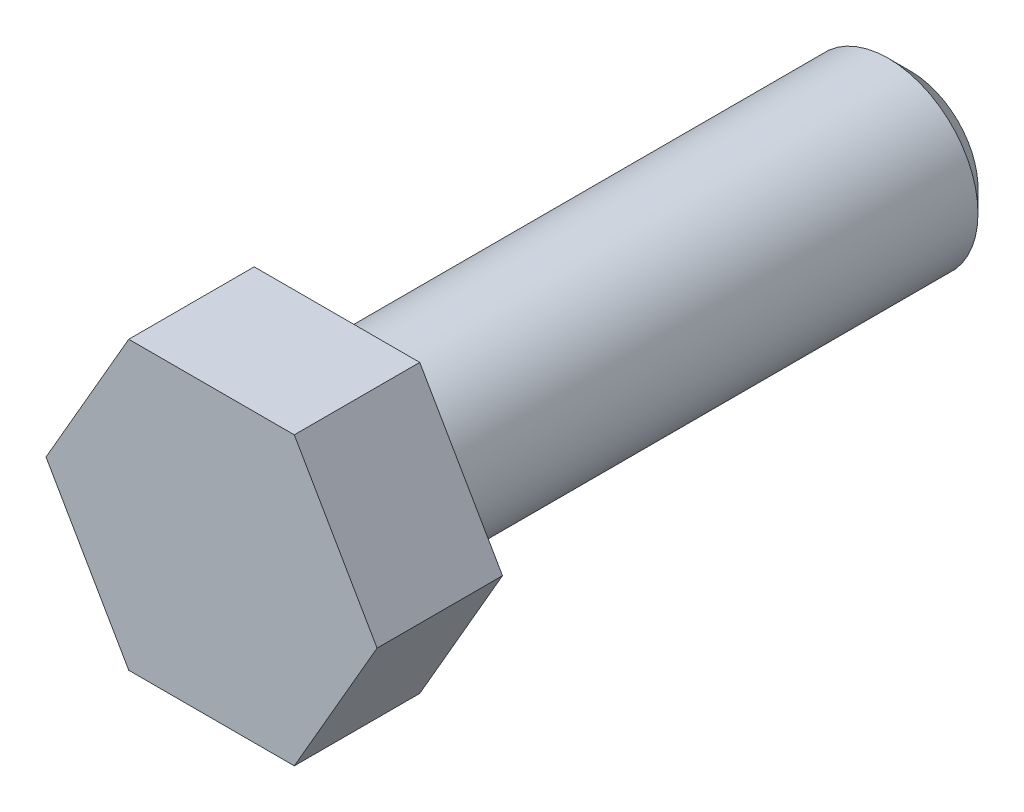
ISO-10303-21;
HEADER;
FILE_DESCRIPTION(('STEP AP214'),'2;1');
FILE_NAME('part.step','',(''),(''),'','','');
FILE_SCHEMA(('AUTOMOTIVE_DESIGN { 1 0 10303 214 1 1 1 1 }'));
ENDSEC;
DATA;
#1=APPLICATION_CONTEXT('core data for automotive mechanical design processes');
#2=APPLICATION_PROTOCOL_DEFINITION('international standard','automotive_design',2000,#1);
#3=PRODUCT_CONTEXT('',#1,'mechanical');
#4=PRODUCT('Part','Part','',(#3));
#5=PRODUCT_RELATED_PRODUCT_CATEGORY('part','',(#4));
#6=PRODUCT_DEFINITION_FORMATION('','',#4);
#7=PRODUCT_DEFINITION_CONTEXT('part definition',#1,'design');
#8=PRODUCT_DEFINITION('design','',#6,#7);
#9=PRODUCT_DEFINITION_SHAPE('','',#8);
#10=(LENGTH_UNIT() NAMED_UNIT(*) SI_UNIT(.MILLI.,.METRE.));
#11=(NAMED_UNIT(*) PLANE_ANGLE_UNIT() SI_UNIT($,.RADIAN.));
#12=(NAMED_UNIT(*) SI_UNIT($,.STERADIAN.) SOLID_ANGLE_UNIT());
#13=UNCERTAINTY_MEASURE_WITH_UNIT(LENGTH_MEASURE(1.E-05),#10,'distance_accuracy_value','');
#14=(GEOMETRIC_REPRESENTATION_CONTEXT(3) GLOBAL_UNCERTAINTY_ASSIGNED_CONTEXT((#13)) GLOBAL_UNIT_ASSIGNED_CONTEXT((#10,
#11,#12)) REPRESENTATION_CONTEXT('',''));
#15=CARTESIAN_POINT('',(0.,0.,0.));
#16=DIRECTION('',(0.,0.,1.));
#17=DIRECTION('',(1.,0.,0.));
#18=AXIS2_PLACEMENT_3D('',#15,#16,#17);
#19=CARTESIAN_POINT('',(-6.9282032302755,-4.,0.));
#20=DIRECTION('',(0.,0.,1.));
#21=DIRECTION('',(1.,0.,0.));
#22=AXIS2_PLACEMENT_3D('',#19,#20,#21);
#23=PLANE('',#22);
#24=CARTESIAN_POINT('',(0.,0.,0.));
#25=DIRECTION('',(0.,0.,1.));
#26=DIRECTION('',(1.,0.,0.));
#27=AXIS2_PLACEMENT_3D('',#24,#25,#26);
#28=CIRCLE('',#27,2.75);
#29=CARTESIAN_POINT('',(2.75,0.,0.));
#30=VERTEX_POINT('',#29);
#31=EDGE_CURVE('E11',#30,#30,#28,.T.);
#32=ORIENTED_EDGE('',*,*,#31,.T.);
#33=EDGE_LOOP('',(#32));
#34=FACE_BOUND('',#33,.T.);
#35=DIRECTION('',(-0.499999999999999,-0.866025403784439,0.));
#36=VECTOR('',#35,1.);
#37=CARTESIAN_POINT('',(-2.30940107675851,4.,0.));
#38=LINE('',#37,#36);
#39=CARTESIAN_POINT('',(-2.30940107675851,4.,0.));
#40=VERTEX_POINT('',#39);
#41=CARTESIAN_POINT('',(-4.618802153517,0.,0.));
#42=VERTEX_POINT('',#41);
#43=EDGE_CURVE('E116',#40,#42,#38,.T.);
#44=ORIENTED_EDGE('',*,*,#43,.F.);
#45=DIRECTION('',(1.,0.,0.));
#46=VECTOR('',#45,1.);
#47=CARTESIAN_POINT('',(-2.30940107675851,4.,0.));
#48=LINE('',#47,#46);
#49=CARTESIAN_POINT('',(2.3094010767585,4.,0.));
#50=VERTEX_POINT('',#49);
#51=EDGE_CURVE('E126',#40,#50,#48,.T.);
#52=ORIENTED_EDGE('',*,*,#51,.T.);
#53=DIRECTION('',(0.5,-0.866025403784438,0.));
#54=VECTOR('',#53,1.);
#55=CARTESIAN_POINT('',(2.3094010767585,4.,0.));
#56=LINE('',#55,#54);
#57=CARTESIAN_POINT('',(4.618802153517,0.,0.));
#58=VERTEX_POINT('',#57);
#59=EDGE_CURVE('E124',#50,#58,#56,.T.);
#60=ORIENTED_EDGE('',*,*,#59,.T.);
#61=DIRECTION('',(-0.499999999999999,-0.866025403784439,0.));
#62=VECTOR('',#61,1.);
#63=CARTESIAN_POINT('',(4.618802153517,0.,0.));
#64=LINE('',#63,#62);
#65=CARTESIAN_POINT('',(2.3094010767585,-4.,0.));
#66=VERTEX_POINT('',#65);
#67=EDGE_CURVE('E95',#58,#66,#64,.T.);
#68=ORIENTED_EDGE('',*,*,#67,.T.);
#69=DIRECTION('',(1.,0.,0.));
#70=VECTOR('',#69,1.);
#71=CARTESIAN_POINT('',(-2.3094010767585,-4.,0.));
#72=LINE('',#71,#70);
#73=CARTESIAN_POINT('',(-2.3094010767585,-4.,0.));
#74=VERTEX_POINT('',#73);
#75=EDGE_CURVE('E120',#74,#66,#72,.T.);
#76=ORIENTED_EDGE('',*,*,#75,.F.);
#77=DIRECTION('',(0.5,-0.866025403784439,0.));
#78=VECTOR('',#77,1.);
#79=CARTESIAN_POINT('',(-4.618802153517,0.,0.));
#80=LINE('',#79,#78);
#81=EDGE_CURVE('E118',#42,#74,#80,.T.);
#82=ORIENTED_EDGE('',*,*,#81,.F.);
#83=EDGE_LOOP('',(#44,#52,#60,#68,#76,#82));
#84=FACE_BOUND('',#83,.T.);
#85=ADVANCED_FACE('F30',(#34,#84),#23,.F.);
#86=CARTESIAN_POINT('',(-2.30940107675851,4.,3.5));
#87=DIRECTION('',(0.866025403784439,-0.499999999999999,0.));
#88=DIRECTION('',(0.499999999999999,0.866025403784439,0.));
#89=AXIS2_PLACEMENT_3D('',#86,#87,#88);
#90=PLANE('',#89);
#91=ORIENTED_EDGE('',*,*,#43,.T.);
#92=DIRECTION('',(0.,0.,-1.));
#93=VECTOR('',#92,1.);
#94=CARTESIAN_POINT('',(-4.618802153517,0.,3.5));
#95=LINE('',#94,#93);
#96=CARTESIAN_POINT('',(-4.618802153517,0.,3.5));
#97=VERTEX_POINT('',#96);
#98=EDGE_CURVE('E136',#97,#42,#95,.T.);
#99=ORIENTED_EDGE('',*,*,#98,.F.);
#100=DIRECTION('',(-0.499999999999999,-0.866025403784439,0.));
#101=VECTOR('',#100,1.);
#102=CARTESIAN_POINT('',(-2.30940107675851,4.,3.5));
#103=LINE('',#102,#101);
#104=CARTESIAN_POINT('',(-2.30940107675851,4.,3.5));
#105=VERTEX_POINT('',#104);
#106=EDGE_CURVE('E129',#105,#97,#103,.T.);
#107=ORIENTED_EDGE('',*,*,#106,.F.);
#108=DIRECTION('',(0.,0.,-1.));
#109=VECTOR('',#108,1.);
#110=CARTESIAN_POINT('',(-2.30940107675851,4.,3.5));
#111=LINE('',#110,#109);
#112=EDGE_CURVE('E47',#105,#40,#111,.T.);
#113=ORIENTED_EDGE('',*,*,#112,.T.);
#114=EDGE_LOOP('',(#91,#99,#107,#113));
#115=FACE_BOUND('',#114,.T.);
#116=ADVANCED_FACE('F159',(#115),#90,.F.);
#117=CARTESIAN_POINT('',(-4.618802153517,0.,3.5));
#118=DIRECTION('',(0.866025403784439,0.5,0.));
#119=DIRECTION('',(-0.5,0.866025403784439,0.));
#120=AXIS2_PLACEMENT_3D('',#117,#118,#119);
#121=PLANE('',#120);
#122=ORIENTED_EDGE('',*,*,#81,.T.);
#123=DIRECTION('',(0.,0.,-1.));
#124=VECTOR('',#123,1.);
#125=CARTESIAN_POINT('',(-2.3094010767585,-4.,3.5));
#126=LINE('',#125,#124);
#127=CARTESIAN_POINT('',(-2.3094010767585,-4.,3.5));
#128=VERTEX_POINT('',#127);
#129=EDGE_CURVE('E133',#128,#74,#126,.T.);
#130=ORIENTED_EDGE('',*,*,#129,.F.);
#131=DIRECTION('',(0.5,-0.866025403784439,0.));
#132=VECTOR('',#131,1.);
#133=CARTESIAN_POINT('',(-4.618802153517,0.,3.5));
#134=LINE('',#133,#132);
#135=EDGE_CURVE('E80',#97,#128,#134,.T.);
#136=ORIENTED_EDGE('',*,*,#135,.F.);
#137=ORIENTED_EDGE('',*,*,#98,.T.);
#138=EDGE_LOOP('',(#122,#130,#136,#137));
#139=FACE_BOUND('',#138,.T.);
#140=ADVANCED_FACE('F165',(#139),#121,.F.);
#141=CARTESIAN_POINT('',(-2.3094010767585,-4.,3.5));
#142=DIRECTION('',(0.,1.,0.));
#143=DIRECTION('',(0.,0.,1.));
#144=AXIS2_PLACEMENT_3D('',#141,#142,#143);
#145=PLANE('',#144);
#146=ORIENTED_EDGE('',*,*,#75,.T.);
#147=DIRECTION('',(0.,0.,-1.));
#148=VECTOR('',#147,1.);
#149=CARTESIAN_POINT('',(2.3094010767585,-4.,3.5));
#150=LINE('',#149,#148);
#151=CARTESIAN_POINT('',(2.3094010767585,-4.,3.5));
#152=VERTEX_POINT('',#151);
#153=EDGE_CURVE('E99',#152,#66,#150,.T.);
#154=ORIENTED_EDGE('',*,*,#153,.F.);
#155=DIRECTION('',(1.,0.,0.));
#156=VECTOR('',#155,1.);
#157=CARTESIAN_POINT('',(-2.3094010767585,-4.,3.5));
#158=LINE('',#157,#156);
#159=EDGE_CURVE('E107',#128,#152,#158,.T.);
#160=ORIENTED_EDGE('',*,*,#159,.F.);
#161=ORIENTED_EDGE('',*,*,#129,.T.);
#162=EDGE_LOOP('',(#146,#154,#160,#161));
#163=FACE_BOUND('',#162,.T.);
#164=ADVANCED_FACE('F178',(#163),#145,.F.);
#165=CARTESIAN_POINT('',(4.618802153517,0.,3.5));
#166=DIRECTION('',(0.866025403784439,-0.499999999999999,0.));
#167=DIRECTION('',(0.499999999999999,0.866025403784439,0.));
#168=AXIS2_PLACEMENT_3D('',#165,#166,#167);
#169=PLANE('',#168);
#170=ORIENTED_EDGE('',*,*,#67,.F.);
#171=DIRECTION('',(0.,0.,-1.));
#172=VECTOR('',#171,1.);
#173=CARTESIAN_POINT('',(4.618802153517,0.,3.5));
#174=LINE('',#173,#172);
#175=CARTESIAN_POINT('',(4.618802153517,0.,3.5));
#176=VERTEX_POINT('',#175);
#177=EDGE_CURVE('E90',#176,#58,#174,.T.);
#178=ORIENTED_EDGE('',*,*,#177,.F.);
#179=DIRECTION('',(-0.499999999999999,-0.866025403784439,0.));
#180=VECTOR('',#179,1.);
#181=CARTESIAN_POINT('',(4.618802153517,0.,3.5));
#182=LINE('',#181,#180);
#183=EDGE_CURVE('E93',#176,#152,#182,.T.);
#184=ORIENTED_EDGE('',*,*,#183,.T.);
#185=ORIENTED_EDGE('',*,*,#153,.T.);
#186=EDGE_LOOP('',(#170,#178,#184,#185));
#187=FACE_BOUND('',#186,.T.);
#188=ADVANCED_FACE('F92',(#187),#169,.T.);
#189=CARTESIAN_POINT('',(2.3094010767585,4.,3.5));
#190=DIRECTION('',(0.866025403784438,0.5,0.));
#191=DIRECTION('',(-0.5,0.866025403784439,0.));
#192=AXIS2_PLACEMENT_3D('',#189,#190,#191);
#193=PLANE('',#192);
#194=ORIENTED_EDGE('',*,*,#59,.F.);
#195=DIRECTION('',(0.,0.,-1.));
#196=VECTOR('',#195,1.);
#197=CARTESIAN_POINT('',(2.3094010767585,4.,3.5));
#198=LINE('',#197,#196);
#199=CARTESIAN_POINT('',(2.3094010767585,4.,3.5));
#200=VERTEX_POINT('',#199);
#201=EDGE_CURVE('E67',#200,#50,#198,.T.);
#202=ORIENTED_EDGE('',*,*,#201,.F.);
#203=DIRECTION('',(0.5,-0.866025403784438,0.));
#204=VECTOR('',#203,1.);
#205=CARTESIAN_POINT('',(2.3094010767585,4.,3.5));
#206=LINE('',#205,#204);
#207=EDGE_CURVE('E105',#200,#176,#206,.T.);
#208=ORIENTED_EDGE('',*,*,#207,.T.);
#209=ORIENTED_EDGE('',*,*,#177,.T.);
#210=EDGE_LOOP('',(#194,#202,#208,#209));
#211=FACE_BOUND('',#210,.T.);
#212=ADVANCED_FACE('F110',(#211),#193,.T.);
#213=CARTESIAN_POINT('',(-2.30940107675851,4.,3.5));
#214=DIRECTION('',(0.,1.,0.));
#215=DIRECTION('',(0.,0.,1.));
#216=AXIS2_PLACEMENT_3D('',#213,#214,#215);
#217=PLANE('',#216);
#218=ORIENTED_EDGE('',*,*,#51,.F.);
#219=ORIENTED_EDGE('',*,*,#112,.F.);
#220=DIRECTION('',(1.,0.,0.));
#221=VECTOR('',#220,1.);
#222=CARTESIAN_POINT('',(-2.30940107675851,4.,3.5));
#223=LINE('',#222,#221);
#224=EDGE_CURVE('E111',#105,#200,#223,.T.);
#225=ORIENTED_EDGE('',*,*,#224,.T.);
#226=ORIENTED_EDGE('',*,*,#201,.T.);
#227=EDGE_LOOP('',(#218,#219,#225,#226));
#228=FACE_BOUND('',#227,.T.);
#229=ADVANCED_FACE('F171',(#228),#217,.T.);
#230=CARTESIAN_POINT('',(-6.9282032302755,-4.,3.5));
#231=DIRECTION('',(0.,0.,1.));
#232=DIRECTION('',(1.,0.,0.));
#233=AXIS2_PLACEMENT_3D('',#230,#231,#232);
#234=PLANE('',#233);
#235=ORIENTED_EDGE('',*,*,#106,.T.);
#236=ORIENTED_EDGE('',*,*,#135,.T.);
#237=ORIENTED_EDGE('',*,*,#159,.T.);
#238=ORIENTED_EDGE('',*,*,#183,.F.);
#239=ORIENTED_EDGE('',*,*,#207,.F.);
#240=ORIENTED_EDGE('',*,*,#224,.F.);
#241=EDGE_LOOP('',(#235,#236,#237,#238,#239,#240));
#242=FACE_BOUND('',#241,.T.);
#243=ADVANCED_FACE('F103',(#242),#234,.T.);
#244=CARTESIAN_POINT('',(0.,0.,-16.));
#245=DIRECTION('',(0.,0.,1.));
#246=DIRECTION('',(1.,0.,0.));
#247=AXIS2_PLACEMENT_3D('',#244,#245,#246);
#248=CYLINDRICAL_SURFACE('',#247,2.5);
#249=CARTESIAN_POINT('',(0.,0.,-0.25));
#250=DIRECTION('',(0.,0.,1.));
#251=DIRECTION('',(1.,0.,0.));
#252=AXIS2_PLACEMENT_3D('',#249,#250,#251);
#253=CIRCLE('',#252,2.5);
#254=CARTESIAN_POINT('',(2.5,0.,-0.25));
#255=VERTEX_POINT('',#254);
#256=EDGE_CURVE('E39',#255,#255,#253,.F.);
#257=ORIENTED_EDGE('',*,*,#256,.T.);
#258=EDGE_LOOP('',(#257));
#259=FACE_BOUND('',#258,.T.);
#260=CARTESIAN_POINT('',(0.,0.,-15.3866));
#261=DIRECTION('',(0.,0.,-1.));
#262=DIRECTION('',(-1.,0.,0.));
#263=AXIS2_PLACEMENT_3D('',#260,#261,#262);
#264=CIRCLE('',#263,2.5);
#265=CARTESIAN_POINT('',(-2.5,0.,-15.3866));
#266=VERTEX_POINT('',#265);
#267=EDGE_CURVE('E141',#266,#266,#264,.F.);
#268=ORIENTED_EDGE('',*,*,#267,.T.);
#269=EDGE_LOOP('',(#268));
#270=FACE_BOUND('',#269,.T.);
#271=ADVANCED_FACE('F146',(#259,#270),#248,.T.);
#272=CARTESIAN_POINT('',(0.,0.,-16.));
#273=DIRECTION('',(0.,0.,-1.));
#274=DIRECTION('',(-1.,0.,0.));
#275=AXIS2_PLACEMENT_3D('',#272,#273,#274);
#276=PLANE('',#275);
#277=CARTESIAN_POINT('',(0.,0.,-16.));
#278=DIRECTION('',(0.,0.,-1.));
#279=DIRECTION('',(-1.,0.,0.));
#280=AXIS2_PLACEMENT_3D('',#277,#278,#279);
#281=CIRCLE('',#280,1.88659999999999);
#282=CARTESIAN_POINT('',(-1.88659999999999,0.,-16.));
#283=VERTEX_POINT('',#282);
#284=EDGE_CURVE('E138',#283,#283,#281,.T.);
#285=ORIENTED_EDGE('',*,*,#284,.T.);
#286=EDGE_LOOP('',(#285));
#287=FACE_BOUND('',#286,.T.);
#288=ADVANCED_FACE('F155',(#287),#276,.T.);
#289=CARTESIAN_POINT('',(0.,0.,-16.));
#290=DIRECTION('',(0.,0.,1.));
#291=DIRECTION('',(1.,0.,0.));
#292=AXIS2_PLACEMENT_3D('',#289,#290,#291);
#293=CONICAL_SURFACE('',#292,1.88659999999999,0.785398163397454);
#294=ORIENTED_EDGE('',*,*,#267,.F.);
#295=EDGE_LOOP('',(#294));
#296=FACE_BOUND('',#295,.T.);
#297=ORIENTED_EDGE('',*,*,#284,.F.);
#298=EDGE_LOOP('',(#297));
#299=FACE_BOUND('',#298,.T.);
#300=ADVANCED_FACE('F150',(#296,#299),#293,.T.);
#301=CARTESIAN_POINT('',(0.,0.,-0.25));
#302=DIRECTION('',(0.,0.,1.));
#303=DIRECTION('',(1.,0.,0.));
#304=AXIS2_PLACEMENT_3D('',#301,#302,#303);
#305=TOROIDAL_SURFACE('',#304,2.75,0.25);
#306=ORIENTED_EDGE('',*,*,#31,.F.);
#307=EDGE_LOOP('',(#306));
#308=FACE_BOUND('',#307,.T.);
#309=ORIENTED_EDGE('',*,*,#256,.F.);
#310=EDGE_LOOP('',(#309));
#311=FACE_BOUND('',#310,.T.);
#312=ADVANCED_FACE('F32',(#308,#311),#305,.F.);
#313=CLOSED_SHELL('',(#85,#116,#140,#164,#188,#212,#229,#243,#271,#288,#300,#312));
#314=MANIFOLD_SOLID_BREP('B2',#313);
#315=ADVANCED_BREP_SHAPE_REPRESENTATION('',(#18,#314),#14);
#316=SHAPE_DEFINITION_REPRESENTATION(#9,#315);
ENDSEC;
END-ISO-10303-21;
